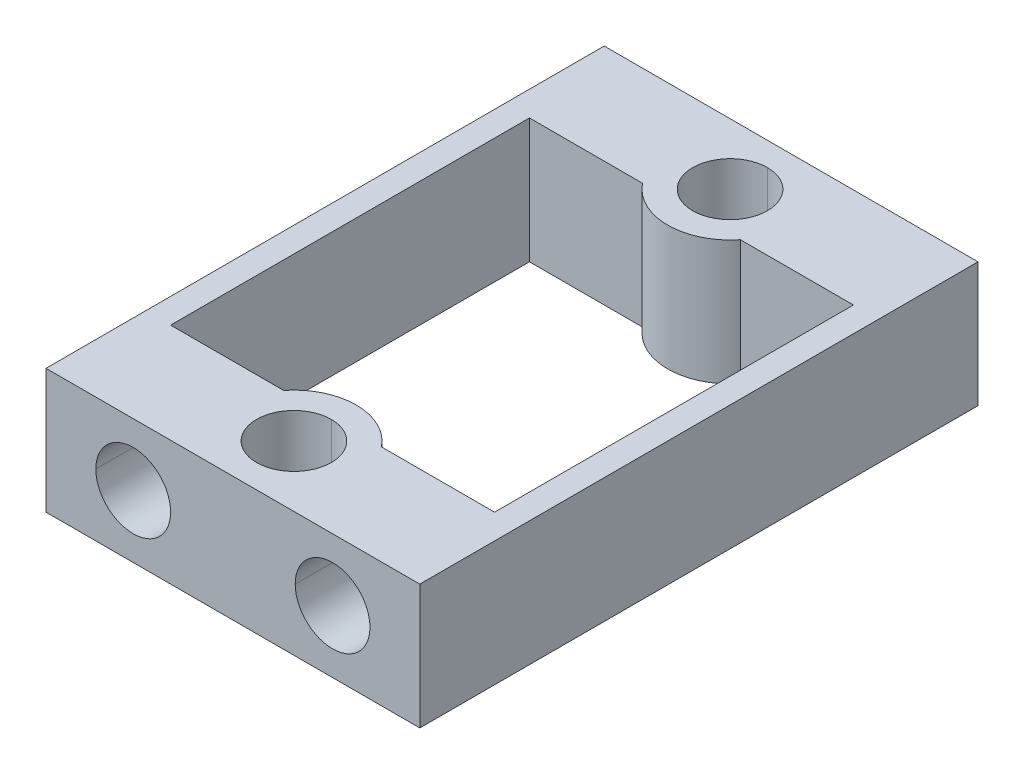
ISO-10303-21;
HEADER;
FILE_DESCRIPTION(('STEP AP214'),'2;1');
FILE_NAME('part.step','',(''),(''),'','','');
FILE_SCHEMA(('AUTOMOTIVE_DESIGN { 1 0 10303 214 1 1 1 1 }'));
ENDSEC;
DATA;
#1=APPLICATION_CONTEXT('core data for automotive mechanical design processes');
#2=APPLICATION_PROTOCOL_DEFINITION('international standard','automotive_design',2000,#1);
#3=PRODUCT_CONTEXT('',#1,'mechanical');
#4=PRODUCT('Part','Part','',(#3));
#5=PRODUCT_RELATED_PRODUCT_CATEGORY('part','',(#4));
#6=PRODUCT_DEFINITION_FORMATION('','',#4);
#7=PRODUCT_DEFINITION_CONTEXT('part definition',#1,'design');
#8=PRODUCT_DEFINITION('design','',#6,#7);
#9=PRODUCT_DEFINITION_SHAPE('','',#8);
#10=(LENGTH_UNIT() NAMED_UNIT(*) SI_UNIT(.MILLI.,.METRE.));
#11=(NAMED_UNIT(*) PLANE_ANGLE_UNIT() SI_UNIT($,.RADIAN.));
#12=(NAMED_UNIT(*) SI_UNIT($,.STERADIAN.) SOLID_ANGLE_UNIT());
#13=UNCERTAINTY_MEASURE_WITH_UNIT(LENGTH_MEASURE(1.E-05),#10,'distance_accuracy_value','');
#14=(GEOMETRIC_REPRESENTATION_CONTEXT(3) GLOBAL_UNCERTAINTY_ASSIGNED_CONTEXT((#13)) GLOBAL_UNIT_ASSIGNED_CONTEXT((#10,
#11,#12)) REPRESENTATION_CONTEXT('',''));
#15=CARTESIAN_POINT('',(0.,0.,0.));
#16=DIRECTION('',(0.,0.,1.));
#17=DIRECTION('',(1.,0.,0.));
#18=AXIS2_PLACEMENT_3D('',#15,#16,#17);
#19=CARTESIAN_POINT('',(11.5,2.5,-5.));
#20=DIRECTION('',(0.,0.,1.));
#21=DIRECTION('',(1.,0.,0.));
#22=AXIS2_PLACEMENT_3D('',#19,#20,#21);
#23=CYLINDRICAL_SURFACE('',#22,1.5);
#24=DIRECTION('',(0.,0.,1.));
#25=VECTOR('',#24,1.);
#26=CARTESIAN_POINT('',(10.,2.5,-5.));
#27=LINE('',#26,#25);
#28=CARTESIAN_POINT('',(10.,2.5,-4.));
#29=VERTEX_POINT('',#28);
#30=CARTESIAN_POINT('',(10.,2.5,0.));
#31=VERTEX_POINT('',#30);
#32=EDGE_CURVE('E195',#29,#31,#27,.T.);
#33=ORIENTED_EDGE('',*,*,#32,.F.);
#34=CARTESIAN_POINT('',(11.5,2.5,-4.));
#35=DIRECTION('',(0.,0.,-1.));
#36=DIRECTION('',(-1.,0.,0.));
#37=AXIS2_PLACEMENT_3D('',#34,#35,#36);
#38=CIRCLE('',#37,1.5);
#39=CARTESIAN_POINT('',(13.,2.5,-4.));
#40=VERTEX_POINT('',#39);
#41=EDGE_CURVE('E303',#29,#40,#38,.T.);
#42=ORIENTED_EDGE('',*,*,#41,.T.);
#43=DIRECTION('',(0.,0.,1.));
#44=VECTOR('',#43,1.);
#45=CARTESIAN_POINT('',(13.,2.5,-5.));
#46=LINE('',#45,#44);
#47=CARTESIAN_POINT('',(13.,2.5,0.));
#48=VERTEX_POINT('',#47);
#49=EDGE_CURVE('E194',#40,#48,#46,.T.);
#50=ORIENTED_EDGE('',*,*,#49,.T.);
#51=CARTESIAN_POINT('',(11.5,2.5,0.));
#52=DIRECTION('',(0.,0.,1.));
#53=DIRECTION('',(1.,0.,0.));
#54=AXIS2_PLACEMENT_3D('',#51,#52,#53);
#55=CIRCLE('',#54,1.5);
#56=EDGE_CURVE('E317',#48,#31,#55,.T.);
#57=ORIENTED_EDGE('',*,*,#56,.T.);
#58=EDGE_LOOP('',(#33,#42,#50,#57));
#59=FACE_BOUND('',#58,.T.);
#60=ADVANCED_FACE('F15',(#59),#23,.F.);
#61=CARTESIAN_POINT('',(3.5,2.5,-5.));
#62=DIRECTION('',(0.,0.,1.));
#63=DIRECTION('',(1.,0.,0.));
#64=AXIS2_PLACEMENT_3D('',#61,#62,#63);
#65=CYLINDRICAL_SURFACE('',#64,1.5);
#66=DIRECTION('',(0.,0.,1.));
#67=VECTOR('',#66,1.);
#68=CARTESIAN_POINT('',(2.,2.5,-5.));
#69=LINE('',#68,#67);
#70=CARTESIAN_POINT('',(2.,2.5,-4.));
#71=VERTEX_POINT('',#70);
#72=CARTESIAN_POINT('',(2.,2.5,0.));
#73=VERTEX_POINT('',#72);
#74=EDGE_CURVE('E260',#71,#73,#69,.T.);
#75=ORIENTED_EDGE('',*,*,#74,.F.);
#76=CARTESIAN_POINT('',(3.5,2.5,-4.));
#77=DIRECTION('',(0.,0.,-1.));
#78=DIRECTION('',(-1.,0.,0.));
#79=AXIS2_PLACEMENT_3D('',#76,#77,#78);
#80=CIRCLE('',#79,1.5);
#81=CARTESIAN_POINT('',(5.,2.5,-4.));
#82=VERTEX_POINT('',#81);
#83=EDGE_CURVE('E189',#71,#82,#80,.T.);
#84=ORIENTED_EDGE('',*,*,#83,.T.);
#85=DIRECTION('',(0.,0.,1.));
#86=VECTOR('',#85,1.);
#87=CARTESIAN_POINT('',(5.,2.5,-5.));
#88=LINE('',#87,#86);
#89=CARTESIAN_POINT('',(5.,2.5,0.));
#90=VERTEX_POINT('',#89);
#91=EDGE_CURVE('E259',#82,#90,#88,.T.);
#92=ORIENTED_EDGE('',*,*,#91,.T.);
#93=CARTESIAN_POINT('',(3.5,2.5,0.));
#94=DIRECTION('',(0.,0.,1.));
#95=DIRECTION('',(1.,0.,0.));
#96=AXIS2_PLACEMENT_3D('',#93,#94,#95);
#97=CIRCLE('',#96,1.5);
#98=EDGE_CURVE('E337',#90,#73,#97,.T.);
#99=ORIENTED_EDGE('',*,*,#98,.T.);
#100=EDGE_LOOP('',(#75,#84,#92,#99));
#101=FACE_BOUND('',#100,.T.);
#102=ADVANCED_FACE('F453',(#101),#65,.F.);
#103=CARTESIAN_POINT('',(0.,0.,0.));
#104=DIRECTION('',(0.,1.,0.));
#105=DIRECTION('',(1.,0.,0.));
#106=AXIS2_PLACEMENT_3D('',#103,#104,#105);
#107=PLANE('',#106);
#108=CARTESIAN_POINT('',(7.5,0.,-2.45));
#109=DIRECTION('',(0.,1.,0.));
#110=DIRECTION('',(0.,0.,1.));
#111=AXIS2_PLACEMENT_3D('',#108,#109,#110);
#112=CIRCLE('',#111,1.5);
#113=CARTESIAN_POINT('',(7.5,0.,-3.95));
#114=VERTEX_POINT('',#113);
#115=CARTESIAN_POINT('',(7.5,0.,-0.95));
#116=VERTEX_POINT('',#115);
#117=EDGE_CURVE('E333',#114,#116,#112,.T.);
#118=ORIENTED_EDGE('',*,*,#117,.T.);
#119=CARTESIAN_POINT('',(7.5,0.,-2.45));
#120=DIRECTION('',(0.,1.,0.));
#121=DIRECTION('',(0.,0.,1.));
#122=AXIS2_PLACEMENT_3D('',#119,#120,#121);
#123=CIRCLE('',#122,1.5);
#124=EDGE_CURVE('E9',#116,#114,#123,.T.);
#125=ORIENTED_EDGE('',*,*,#124,.T.);
#126=EDGE_LOOP('',(#118,#125));
#127=FACE_BOUND('',#126,.T.);
#128=CARTESIAN_POINT('',(7.5,0.,-19.95));
#129=DIRECTION('',(0.,1.,0.));
#130=DIRECTION('',(0.,0.,1.));
#131=AXIS2_PLACEMENT_3D('',#128,#129,#130);
#132=CIRCLE('',#131,1.5);
#133=CARTESIAN_POINT('',(7.5,0.,-21.45));
#134=VERTEX_POINT('',#133);
#135=CARTESIAN_POINT('',(7.5,0.,-18.45));
#136=VERTEX_POINT('',#135);
#137=EDGE_CURVE('E273',#134,#136,#132,.T.);
#138=ORIENTED_EDGE('',*,*,#137,.T.);
#139=CARTESIAN_POINT('',(7.5,0.,-19.95));
#140=DIRECTION('',(0.,1.,0.));
#141=DIRECTION('',(0.,0.,1.));
#142=AXIS2_PLACEMENT_3D('',#139,#140,#141);
#143=CIRCLE('',#142,1.5);
#144=EDGE_CURVE('E324',#136,#134,#143,.T.);
#145=ORIENTED_EDGE('',*,*,#144,.T.);
#146=EDGE_LOOP('',(#138,#145));
#147=FACE_BOUND('',#146,.T.);
#148=DIRECTION('',(1.,0.,0.));
#149=VECTOR('',#148,1.);
#150=CARTESIAN_POINT('',(0.,0.,-4.));
#151=LINE('',#150,#149);
#152=CARTESIAN_POINT('',(9.4615045245933,0.,-4.));
#153=VERTEX_POINT('',#152);
#154=CARTESIAN_POINT('',(14.,0.,-4.));
#155=VERTEX_POINT('',#154);
#156=EDGE_CURVE('E167',#153,#155,#151,.T.);
#157=ORIENTED_EDGE('',*,*,#156,.T.);
#158=DIRECTION('',(0.,0.,-1.));
#159=VECTOR('',#158,1.);
#160=CARTESIAN_POINT('',(14.,0.,0.));
#161=LINE('',#160,#159);
#162=CARTESIAN_POINT('',(14.,0.,-18.4));
#163=VERTEX_POINT('',#162);
#164=EDGE_CURVE('E343',#155,#163,#161,.T.);
#165=ORIENTED_EDGE('',*,*,#164,.T.);
#166=DIRECTION('',(1.,0.,0.));
#167=VECTOR('',#166,1.);
#168=CARTESIAN_POINT('',(0.,0.,-18.4));
#169=LINE('',#168,#167);
#170=CARTESIAN_POINT('',(9.4615045245933,0.,-18.4));
#171=VERTEX_POINT('',#170);
#172=EDGE_CURVE('E240',#171,#163,#169,.T.);
#173=ORIENTED_EDGE('',*,*,#172,.F.);
#174=CARTESIAN_POINT('',(7.5,0.,-19.95));
#175=DIRECTION('',(0.,1.,0.));
#176=DIRECTION('',(0.,0.,1.));
#177=AXIS2_PLACEMENT_3D('',#174,#175,#176);
#178=CIRCLE('',#177,2.5);
#179=CARTESIAN_POINT('',(5.5384954754067,0.,-18.4));
#180=VERTEX_POINT('',#179);
#181=EDGE_CURVE('E245',#180,#171,#178,.T.);
#182=ORIENTED_EDGE('',*,*,#181,.F.);
#183=DIRECTION('',(1.,0.,0.));
#184=VECTOR('',#183,1.);
#185=CARTESIAN_POINT('',(0.,0.,-18.4));
#186=LINE('',#185,#184);
#187=CARTESIAN_POINT('',(1.,0.,-18.4));
#188=VERTEX_POINT('',#187);
#189=EDGE_CURVE('E199',#188,#180,#186,.T.);
#190=ORIENTED_EDGE('',*,*,#189,.F.);
#191=DIRECTION('',(0.,0.,-1.));
#192=VECTOR('',#191,1.);
#193=CARTESIAN_POINT('',(1.,0.,0.));
#194=LINE('',#193,#192);
#195=CARTESIAN_POINT('',(1.,0.,-4.));
#196=VERTEX_POINT('',#195);
#197=EDGE_CURVE('E184',#196,#188,#194,.T.);
#198=ORIENTED_EDGE('',*,*,#197,.F.);
#199=DIRECTION('',(1.,0.,0.));
#200=VECTOR('',#199,1.);
#201=CARTESIAN_POINT('',(0.,0.,-4.));
#202=LINE('',#201,#200);
#203=CARTESIAN_POINT('',(5.5384954754067,0.,-4.));
#204=VERTEX_POINT('',#203);
#205=EDGE_CURVE('E383',#196,#204,#202,.T.);
#206=ORIENTED_EDGE('',*,*,#205,.T.);
#207=CARTESIAN_POINT('',(7.5,0.,-2.45));
#208=DIRECTION('',(0.,1.,0.));
#209=DIRECTION('',(0.,0.,1.));
#210=AXIS2_PLACEMENT_3D('',#207,#208,#209);
#211=CIRCLE('',#210,2.5);
#212=CARTESIAN_POINT('',(7.5,0.,-4.95));
#213=VERTEX_POINT('',#212);
#214=EDGE_CURVE('E288',#213,#204,#211,.T.);
#215=ORIENTED_EDGE('',*,*,#214,.F.);
#216=CARTESIAN_POINT('',(7.5,0.,-2.45));
#217=DIRECTION('',(0.,1.,0.));
#218=DIRECTION('',(0.,0.,1.));
#219=AXIS2_PLACEMENT_3D('',#216,#217,#218);
#220=CIRCLE('',#219,2.5);
#221=EDGE_CURVE('E302',#153,#213,#220,.T.);
#222=ORIENTED_EDGE('',*,*,#221,.F.);
#223=EDGE_LOOP('',(#157,#165,#173,#182,#190,#198,#206,#215,#222));
#224=FACE_BOUND('',#223,.T.);
#225=DIRECTION('',(1.,0.,0.));
#226=VECTOR('',#225,1.);
#227=CARTESIAN_POINT('',(0.,0.,0.));
#228=LINE('',#227,#226);
#229=CARTESIAN_POINT('',(0.,0.,0.));
#230=VERTEX_POINT('',#229);
#231=CARTESIAN_POINT('',(15.,0.,0.));
#232=VERTEX_POINT('',#231);
#233=EDGE_CURVE('E261',#230,#232,#228,.T.);
#234=ORIENTED_EDGE('',*,*,#233,.F.);
#235=DIRECTION('',(0.,0.,-1.));
#236=VECTOR('',#235,1.);
#237=CARTESIAN_POINT('',(0.,0.,0.));
#238=LINE('',#237,#236);
#239=CARTESIAN_POINT('',(0.,0.,-22.4));
#240=VERTEX_POINT('',#239);
#241=EDGE_CURVE('E156',#230,#240,#238,.T.);
#242=ORIENTED_EDGE('',*,*,#241,.T.);
#243=DIRECTION('',(1.,0.,0.));
#244=VECTOR('',#243,1.);
#245=CARTESIAN_POINT('',(0.,0.,-22.4));
#246=LINE('',#245,#244);
#247=CARTESIAN_POINT('',(15.,0.,-22.4));
#248=VERTEX_POINT('',#247);
#249=EDGE_CURVE('E170',#240,#248,#246,.T.);
#250=ORIENTED_EDGE('',*,*,#249,.T.);
#251=DIRECTION('',(0.,0.,-1.));
#252=VECTOR('',#251,1.);
#253=CARTESIAN_POINT('',(15.,0.,0.));
#254=LINE('',#253,#252);
#255=EDGE_CURVE('E313',#232,#248,#254,.T.);
#256=ORIENTED_EDGE('',*,*,#255,.F.);
#257=EDGE_LOOP('',(#234,#242,#250,#256));
#258=FACE_BOUND('',#257,.T.);
#259=ADVANCED_FACE('F400',(#127,#147,#224,#258),#107,.F.);
#260=CARTESIAN_POINT('',(0.,5.,0.));
#261=DIRECTION('',(0.,1.,0.));
#262=DIRECTION('',(1.,0.,0.));
#263=AXIS2_PLACEMENT_3D('',#260,#261,#262);
#264=PLANE('',#263);
#265=CARTESIAN_POINT('',(7.5,5.,-2.45));
#266=DIRECTION('',(0.,1.,0.));
#267=DIRECTION('',(0.,0.,1.));
#268=AXIS2_PLACEMENT_3D('',#265,#266,#267);
#269=CIRCLE('',#268,1.5);
#270=CARTESIAN_POINT('',(7.5,5.,-3.95));
#271=VERTEX_POINT('',#270);
#272=CARTESIAN_POINT('',(7.5,5.,-0.95));
#273=VERTEX_POINT('',#272);
#274=EDGE_CURVE('E290',#271,#273,#269,.T.);
#275=ORIENTED_EDGE('',*,*,#274,.F.);
#276=CARTESIAN_POINT('',(7.5,5.,-2.45));
#277=DIRECTION('',(0.,1.,0.));
#278=DIRECTION('',(0.,0.,1.));
#279=AXIS2_PLACEMENT_3D('',#276,#277,#278);
#280=CIRCLE('',#279,1.5);
#281=EDGE_CURVE('E26',#273,#271,#280,.T.);
#282=ORIENTED_EDGE('',*,*,#281,.F.);
#283=EDGE_LOOP('',(#275,#282));
#284=FACE_BOUND('',#283,.T.);
#285=CARTESIAN_POINT('',(7.5,5.,-19.95));
#286=DIRECTION('',(0.,1.,0.));
#287=DIRECTION('',(0.,0.,1.));
#288=AXIS2_PLACEMENT_3D('',#285,#286,#287);
#289=CIRCLE('',#288,1.5);
#290=CARTESIAN_POINT('',(7.5,5.,-21.45));
#291=VERTEX_POINT('',#290);
#292=CARTESIAN_POINT('',(7.5,5.,-18.45));
#293=VERTEX_POINT('',#292);
#294=EDGE_CURVE('E249',#291,#293,#289,.T.);
#295=ORIENTED_EDGE('',*,*,#294,.F.);
#296=CARTESIAN_POINT('',(7.5,5.,-19.95));
#297=DIRECTION('',(0.,1.,0.));
#298=DIRECTION('',(0.,0.,1.));
#299=AXIS2_PLACEMENT_3D('',#296,#297,#298);
#300=CIRCLE('',#299,1.5);
#301=EDGE_CURVE('E155',#293,#291,#300,.T.);
#302=ORIENTED_EDGE('',*,*,#301,.F.);
#303=EDGE_LOOP('',(#295,#302));
#304=FACE_BOUND('',#303,.T.);
#305=DIRECTION('',(1.,0.,0.));
#306=VECTOR('',#305,1.);
#307=CARTESIAN_POINT('',(0.,5.,-4.));
#308=LINE('',#307,#306);
#309=CARTESIAN_POINT('',(9.4615045245933,5.,-4.));
#310=VERTEX_POINT('',#309);
#311=CARTESIAN_POINT('',(14.,5.,-4.));
#312=VERTEX_POINT('',#311);
#313=EDGE_CURVE('E229',#310,#312,#308,.T.);
#314=ORIENTED_EDGE('',*,*,#313,.F.);
#315=CARTESIAN_POINT('',(7.5,5.,-2.45));
#316=DIRECTION('',(0.,1.,0.));
#317=DIRECTION('',(0.,0.,1.));
#318=AXIS2_PLACEMENT_3D('',#315,#316,#317);
#319=CIRCLE('',#318,2.5);
#320=CARTESIAN_POINT('',(7.5,5.,-4.95));
#321=VERTEX_POINT('',#320);
#322=EDGE_CURVE('E299',#310,#321,#319,.T.);
#323=ORIENTED_EDGE('',*,*,#322,.T.);
#324=CARTESIAN_POINT('',(7.5,5.,-2.45));
#325=DIRECTION('',(0.,1.,0.));
#326=DIRECTION('',(0.,0.,1.));
#327=AXIS2_PLACEMENT_3D('',#324,#325,#326);
#328=CIRCLE('',#327,2.5);
#329=CARTESIAN_POINT('',(5.5384954754067,5.,-4.));
#330=VERTEX_POINT('',#329);
#331=EDGE_CURVE('E289',#321,#330,#328,.T.);
#332=ORIENTED_EDGE('',*,*,#331,.T.);
#333=DIRECTION('',(1.,0.,0.));
#334=VECTOR('',#333,1.);
#335=CARTESIAN_POINT('',(0.,5.,-4.));
#336=LINE('',#335,#334);
#337=CARTESIAN_POINT('',(1.,5.,-4.));
#338=VERTEX_POINT('',#337);
#339=EDGE_CURVE('E312',#338,#330,#336,.T.);
#340=ORIENTED_EDGE('',*,*,#339,.F.);
#341=DIRECTION('',(0.,0.,-1.));
#342=VECTOR('',#341,1.);
#343=CARTESIAN_POINT('',(1.,5.,0.));
#344=LINE('',#343,#342);
#345=CARTESIAN_POINT('',(1.,5.,-18.4));
#346=VERTEX_POINT('',#345);
#347=EDGE_CURVE('E203',#338,#346,#344,.T.);
#348=ORIENTED_EDGE('',*,*,#347,.T.);
#349=DIRECTION('',(1.,0.,0.));
#350=VECTOR('',#349,1.);
#351=CARTESIAN_POINT('',(0.,5.,-18.4));
#352=LINE('',#351,#350);
#353=CARTESIAN_POINT('',(5.5384954754067,5.,-18.4));
#354=VERTEX_POINT('',#353);
#355=EDGE_CURVE('E213',#346,#354,#352,.T.);
#356=ORIENTED_EDGE('',*,*,#355,.T.);
#357=CARTESIAN_POINT('',(7.5,5.,-19.95));
#358=DIRECTION('',(0.,1.,0.));
#359=DIRECTION('',(0.,0.,1.));
#360=AXIS2_PLACEMENT_3D('',#357,#358,#359);
#361=CIRCLE('',#360,2.5);
#362=CARTESIAN_POINT('',(9.4615045245933,5.,-18.4));
#363=VERTEX_POINT('',#362);
#364=EDGE_CURVE('E236',#354,#363,#361,.T.);
#365=ORIENTED_EDGE('',*,*,#364,.T.);
#366=DIRECTION('',(1.,0.,0.));
#367=VECTOR('',#366,1.);
#368=CARTESIAN_POINT('',(0.,5.,-18.4));
#369=LINE('',#368,#367);
#370=CARTESIAN_POINT('',(14.,5.,-18.4));
#371=VERTEX_POINT('',#370);
#372=EDGE_CURVE('E183',#363,#371,#369,.T.);
#373=ORIENTED_EDGE('',*,*,#372,.T.);
#374=DIRECTION('',(0.,0.,-1.));
#375=VECTOR('',#374,1.);
#376=CARTESIAN_POINT('',(14.,5.,0.));
#377=LINE('',#376,#375);
#378=EDGE_CURVE('E41',#312,#371,#377,.T.);
#379=ORIENTED_EDGE('',*,*,#378,.F.);
#380=EDGE_LOOP('',(#314,#323,#332,#340,#348,#356,#365,#373,#379));
#381=FACE_BOUND('',#380,.T.);
#382=DIRECTION('',(1.,0.,0.));
#383=VECTOR('',#382,1.);
#384=CARTESIAN_POINT('',(0.,5.,0.));
#385=LINE('',#384,#383);
#386=CARTESIAN_POINT('',(0.,5.,0.));
#387=VERTEX_POINT('',#386);
#388=CARTESIAN_POINT('',(15.,5.,0.));
#389=VERTEX_POINT('',#388);
#390=EDGE_CURVE('E267',#387,#389,#385,.T.);
#391=ORIENTED_EDGE('',*,*,#390,.T.);
#392=DIRECTION('',(0.,0.,-1.));
#393=VECTOR('',#392,1.);
#394=CARTESIAN_POINT('',(15.,5.,0.));
#395=LINE('',#394,#393);
#396=CARTESIAN_POINT('',(15.,5.,-22.4));
#397=VERTEX_POINT('',#396);
#398=EDGE_CURVE('E162',#389,#397,#395,.T.);
#399=ORIENTED_EDGE('',*,*,#398,.T.);
#400=DIRECTION('',(1.,0.,0.));
#401=VECTOR('',#400,1.);
#402=CARTESIAN_POINT('',(0.,5.,-22.4));
#403=LINE('',#402,#401);
#404=CARTESIAN_POINT('',(0.,5.,-22.4));
#405=VERTEX_POINT('',#404);
#406=EDGE_CURVE('E159',#405,#397,#403,.T.);
#407=ORIENTED_EDGE('',*,*,#406,.F.);
#408=DIRECTION('',(0.,0.,-1.));
#409=VECTOR('',#408,1.);
#410=CARTESIAN_POINT('',(0.,5.,0.));
#411=LINE('',#410,#409);
#412=EDGE_CURVE('E143',#387,#405,#411,.T.);
#413=ORIENTED_EDGE('',*,*,#412,.F.);
#414=EDGE_LOOP('',(#391,#399,#407,#413));
#415=FACE_BOUND('',#414,.T.);
#416=ADVANCED_FACE('F160',(#284,#304,#381,#415),#264,.T.);
#417=CARTESIAN_POINT('',(7.5,5.,-2.45));
#418=DIRECTION('',(0.,-1.,0.));
#419=DIRECTION('',(0.,0.,-1.));
#420=AXIS2_PLACEMENT_3D('',#417,#418,#419);
#421=CYLINDRICAL_SURFACE('',#420,1.5);
#422=DIRECTION('',(0.,-1.,0.));
#423=VECTOR('',#422,1.);
#424=CARTESIAN_POINT('',(7.5,5.,-0.95));
#425=LINE('',#424,#423);
#426=EDGE_CURVE('E294',#273,#116,#425,.T.);
#427=ORIENTED_EDGE('',*,*,#426,.F.);
#428=ORIENTED_EDGE('',*,*,#281,.T.);
#429=DIRECTION('',(0.,-1.,0.));
#430=VECTOR('',#429,1.);
#431=CARTESIAN_POINT('',(7.5,5.,-3.95));
#432=LINE('',#431,#430);
#433=EDGE_CURVE('E254',#271,#114,#432,.T.);
#434=ORIENTED_EDGE('',*,*,#433,.T.);
#435=ORIENTED_EDGE('',*,*,#124,.F.);
#436=EDGE_LOOP('',(#427,#428,#434,#435));
#437=FACE_BOUND('',#436,.T.);
#438=ADVANCED_FACE('F440',(#437),#421,.F.);
#439=CARTESIAN_POINT('',(14.,5.,0.));
#440=DIRECTION('',(-1.,0.,0.));
#441=DIRECTION('',(0.,0.,1.));
#442=AXIS2_PLACEMENT_3D('',#439,#440,#441);
#443=PLANE('',#442);
#444=ORIENTED_EDGE('',*,*,#164,.F.);
#445=DIRECTION('',(0.,-1.,0.));
#446=VECTOR('',#445,1.);
#447=CARTESIAN_POINT('',(14.,5.,-4.));
#448=LINE('',#447,#446);
#449=EDGE_CURVE('E19',#312,#155,#448,.T.);
#450=ORIENTED_EDGE('',*,*,#449,.F.);
#451=ORIENTED_EDGE('',*,*,#378,.T.);
#452=DIRECTION('',(0.,-1.,0.));
#453=VECTOR('',#452,1.);
#454=CARTESIAN_POINT('',(14.,5.,-18.4));
#455=LINE('',#454,#453);
#456=EDGE_CURVE('E242',#371,#163,#455,.T.);
#457=ORIENTED_EDGE('',*,*,#456,.T.);
#458=EDGE_LOOP('',(#444,#450,#451,#457));
#459=FACE_BOUND('',#458,.T.);
#460=ADVANCED_FACE('F434',(#459),#443,.T.);
#461=CARTESIAN_POINT('',(7.5,5.,-19.95));
#462=DIRECTION('',(0.,-1.,0.));
#463=DIRECTION('',(0.,0.,-1.));
#464=AXIS2_PLACEMENT_3D('',#461,#462,#463);
#465=CYLINDRICAL_SURFACE('',#464,1.5);
#466=DIRECTION('',(0.,-1.,0.));
#467=VECTOR('',#466,1.);
#468=CARTESIAN_POINT('',(7.5,5.,-18.45));
#469=LINE('',#468,#467);
#470=EDGE_CURVE('E253',#293,#136,#469,.T.);
#471=ORIENTED_EDGE('',*,*,#470,.F.);
#472=ORIENTED_EDGE('',*,*,#301,.T.);
#473=DIRECTION('',(0.,-1.,0.));
#474=VECTOR('',#473,1.);
#475=CARTESIAN_POINT('',(7.5,5.,-21.45));
#476=LINE('',#475,#474);
#477=EDGE_CURVE('E277',#291,#134,#476,.T.);
#478=ORIENTED_EDGE('',*,*,#477,.T.);
#479=ORIENTED_EDGE('',*,*,#144,.F.);
#480=EDGE_LOOP('',(#471,#472,#478,#479));
#481=FACE_BOUND('',#480,.T.);
#482=ADVANCED_FACE('F439',(#481),#465,.F.);
#483=CARTESIAN_POINT('',(0.,5.,0.));
#484=DIRECTION('',(-1.,0.,0.));
#485=DIRECTION('',(0.,1.,0.));
#486=AXIS2_PLACEMENT_3D('',#483,#484,#485);
#487=PLANE('',#486);
#488=ORIENTED_EDGE('',*,*,#241,.F.);
#489=DIRECTION('',(0.,-1.,0.));
#490=VECTOR('',#489,1.);
#491=CARTESIAN_POINT('',(0.,5.,0.));
#492=LINE('',#491,#490);
#493=EDGE_CURVE('E150',#387,#230,#492,.T.);
#494=ORIENTED_EDGE('',*,*,#493,.F.);
#495=ORIENTED_EDGE('',*,*,#412,.T.);
#496=DIRECTION('',(0.,-1.,0.));
#497=VECTOR('',#496,1.);
#498=CARTESIAN_POINT('',(0.,5.,-22.4));
#499=LINE('',#498,#497);
#500=EDGE_CURVE('E147',#405,#240,#499,.T.);
#501=ORIENTED_EDGE('',*,*,#500,.T.);
#502=EDGE_LOOP('',(#488,#494,#495,#501));
#503=FACE_BOUND('',#502,.T.);
#504=ADVANCED_FACE('F145',(#503),#487,.T.);
#505=CARTESIAN_POINT('',(0.,5.,-18.4));
#506=DIRECTION('',(0.,0.,-1.));
#507=DIRECTION('',(0.,-1.,0.));
#508=AXIS2_PLACEMENT_3D('',#505,#506,#507);
#509=PLANE('',#508);
#510=ORIENTED_EDGE('',*,*,#172,.T.);
#511=ORIENTED_EDGE('',*,*,#456,.F.);
#512=ORIENTED_EDGE('',*,*,#372,.F.);
#513=DIRECTION('',(0.,-1.,0.));
#514=VECTOR('',#513,1.);
#515=CARTESIAN_POINT('',(9.4615045245933,5.,-18.4));
#516=LINE('',#515,#514);
#517=EDGE_CURVE('E241',#363,#171,#516,.T.);
#518=ORIENTED_EDGE('',*,*,#517,.T.);
#519=EDGE_LOOP('',(#510,#511,#512,#518));
#520=FACE_BOUND('',#519,.T.);
#521=ADVANCED_FACE('F561',(#520),#509,.F.);
#522=CARTESIAN_POINT('',(7.5,5.,-19.95));
#523=DIRECTION('',(0.,-1.,0.));
#524=DIRECTION('',(0.,0.,-1.));
#525=AXIS2_PLACEMENT_3D('',#522,#523,#524);
#526=CYLINDRICAL_SURFACE('',#525,2.5);
#527=ORIENTED_EDGE('',*,*,#181,.T.);
#528=ORIENTED_EDGE('',*,*,#517,.F.);
#529=ORIENTED_EDGE('',*,*,#364,.F.);
#530=DIRECTION('',(0.,-1.,0.));
#531=VECTOR('',#530,1.);
#532=CARTESIAN_POINT('',(5.5384954754067,5.,-18.4));
#533=LINE('',#532,#531);
#534=EDGE_CURVE('E202',#354,#180,#533,.T.);
#535=ORIENTED_EDGE('',*,*,#534,.T.);
#536=EDGE_LOOP('',(#527,#528,#529,#535));
#537=FACE_BOUND('',#536,.T.);
#538=ADVANCED_FACE('F424',(#537),#526,.T.);
#539=CARTESIAN_POINT('',(0.,5.,-18.4));
#540=DIRECTION('',(0.,0.,-1.));
#541=DIRECTION('',(0.,-1.,0.));
#542=AXIS2_PLACEMENT_3D('',#539,#540,#541);
#543=PLANE('',#542);
#544=ORIENTED_EDGE('',*,*,#189,.T.);
#545=ORIENTED_EDGE('',*,*,#534,.F.);
#546=ORIENTED_EDGE('',*,*,#355,.F.);
#547=DIRECTION('',(0.,-1.,0.));
#548=VECTOR('',#547,1.);
#549=CARTESIAN_POINT('',(1.,5.,-18.4));
#550=LINE('',#549,#548);
#551=EDGE_CURVE('E188',#346,#188,#550,.T.);
#552=ORIENTED_EDGE('',*,*,#551,.T.);
#553=EDGE_LOOP('',(#544,#545,#546,#552));
#554=FACE_BOUND('',#553,.T.);
#555=ADVANCED_FACE('F418',(#554),#543,.F.);
#556=CARTESIAN_POINT('',(1.,5.,0.));
#557=DIRECTION('',(-1.,0.,0.));
#558=DIRECTION('',(0.,0.,1.));
#559=AXIS2_PLACEMENT_3D('',#556,#557,#558);
#560=PLANE('',#559);
#561=ORIENTED_EDGE('',*,*,#197,.T.);
#562=ORIENTED_EDGE('',*,*,#551,.F.);
#563=ORIENTED_EDGE('',*,*,#347,.F.);
#564=DIRECTION('',(0.,-1.,0.));
#565=VECTOR('',#564,1.);
#566=CARTESIAN_POINT('',(1.,5.,-4.));
#567=LINE('',#566,#565);
#568=EDGE_CURVE('E326',#338,#196,#567,.T.);
#569=ORIENTED_EDGE('',*,*,#568,.T.);
#570=EDGE_LOOP('',(#561,#562,#563,#569));
#571=FACE_BOUND('',#570,.T.);
#572=ADVANCED_FACE('F423',(#571),#560,.F.);
#573=CARTESIAN_POINT('',(0.,5.,-4.));
#574=DIRECTION('',(0.,0.,-1.));
#575=DIRECTION('',(0.,-1.,0.));
#576=AXIS2_PLACEMENT_3D('',#573,#574,#575);
#577=PLANE('',#576);
#578=CARTESIAN_POINT('',(3.5,2.5,-4.));
#579=DIRECTION('',(0.,0.,-1.));
#580=DIRECTION('',(-1.,0.,0.));
#581=AXIS2_PLACEMENT_3D('',#578,#579,#580);
#582=CIRCLE('',#581,1.5);
#583=EDGE_CURVE('E295',#82,#71,#582,.T.);
#584=ORIENTED_EDGE('',*,*,#583,.F.);
#585=ORIENTED_EDGE('',*,*,#83,.F.);
#586=EDGE_LOOP('',(#584,#585));
#587=FACE_BOUND('',#586,.T.);
#588=ORIENTED_EDGE('',*,*,#205,.F.);
#589=ORIENTED_EDGE('',*,*,#568,.F.);
#590=ORIENTED_EDGE('',*,*,#339,.T.);
#591=DIRECTION('',(0.,-1.,0.));
#592=VECTOR('',#591,1.);
#593=CARTESIAN_POINT('',(5.5384954754067,5.,-4.));
#594=LINE('',#593,#592);
#595=EDGE_CURVE('E266',#330,#204,#594,.T.);
#596=ORIENTED_EDGE('',*,*,#595,.T.);
#597=EDGE_LOOP('',(#588,#589,#590,#596));
#598=FACE_BOUND('',#597,.T.);
#599=ADVANCED_FACE('F573',(#587,#598),#577,.T.);
#600=CARTESIAN_POINT('',(7.5,5.,-2.45));
#601=DIRECTION('',(0.,-1.,0.));
#602=DIRECTION('',(0.,0.,-1.));
#603=AXIS2_PLACEMENT_3D('',#600,#601,#602);
#604=CYLINDRICAL_SURFACE('',#603,2.5);
#605=DIRECTION('',(0.,-1.,0.));
#606=VECTOR('',#605,1.);
#607=CARTESIAN_POINT('',(7.5,5.,-4.95));
#608=LINE('',#607,#606);
#609=EDGE_CURVE('E284',#321,#213,#608,.T.);
#610=ORIENTED_EDGE('',*,*,#609,.F.);
#611=ORIENTED_EDGE('',*,*,#322,.F.);
#612=DIRECTION('',(0.,-1.,0.));
#613=VECTOR('',#612,1.);
#614=CARTESIAN_POINT('',(9.4615045245933,5.,-4.));
#615=LINE('',#614,#613);
#616=EDGE_CURVE('E232',#310,#153,#615,.T.);
#617=ORIENTED_EDGE('',*,*,#616,.T.);
#618=ORIENTED_EDGE('',*,*,#221,.T.);
#619=EDGE_LOOP('',(#610,#611,#617,#618));
#620=FACE_BOUND('',#619,.T.);
#621=ADVANCED_FACE('F582',(#620),#604,.T.);
#622=CARTESIAN_POINT('',(0.,5.,-4.));
#623=DIRECTION('',(0.,0.,-1.));
#624=DIRECTION('',(0.,-1.,0.));
#625=AXIS2_PLACEMENT_3D('',#622,#623,#624);
#626=PLANE('',#625);
#627=CARTESIAN_POINT('',(11.5,2.5,-4.));
#628=DIRECTION('',(0.,0.,-1.));
#629=DIRECTION('',(-1.,0.,0.));
#630=AXIS2_PLACEMENT_3D('',#627,#628,#629);
#631=CIRCLE('',#630,1.5);
#632=EDGE_CURVE('E196',#40,#29,#631,.T.);
#633=ORIENTED_EDGE('',*,*,#632,.F.);
#634=ORIENTED_EDGE('',*,*,#41,.F.);
#635=EDGE_LOOP('',(#633,#634));
#636=FACE_BOUND('',#635,.T.);
#637=ORIENTED_EDGE('',*,*,#156,.F.);
#638=ORIENTED_EDGE('',*,*,#616,.F.);
#639=ORIENTED_EDGE('',*,*,#313,.T.);
#640=ORIENTED_EDGE('',*,*,#449,.T.);
#641=EDGE_LOOP('',(#637,#638,#639,#640));
#642=FACE_BOUND('',#641,.T.);
#643=ADVANCED_FACE('F17',(#636,#642),#626,.T.);
#644=CARTESIAN_POINT('',(0.,5.,-22.4));
#645=DIRECTION('',(0.,0.,-1.));
#646=DIRECTION('',(0.,-1.,0.));
#647=AXIS2_PLACEMENT_3D('',#644,#645,#646);
#648=PLANE('',#647);
#649=ORIENTED_EDGE('',*,*,#249,.F.);
#650=ORIENTED_EDGE('',*,*,#500,.F.);
#651=ORIENTED_EDGE('',*,*,#406,.T.);
#652=DIRECTION('',(0.,-1.,0.));
#653=VECTOR('',#652,1.);
#654=CARTESIAN_POINT('',(15.,5.,-22.4));
#655=LINE('',#654,#653);
#656=EDGE_CURVE('E280',#397,#248,#655,.T.);
#657=ORIENTED_EDGE('',*,*,#656,.T.);
#658=EDGE_LOOP('',(#649,#650,#651,#657));
#659=FACE_BOUND('',#658,.T.);
#660=ADVANCED_FACE('F169',(#659),#648,.T.);
#661=CARTESIAN_POINT('',(15.,5.,0.));
#662=DIRECTION('',(-1.,0.,0.));
#663=DIRECTION('',(0.,1.,0.));
#664=AXIS2_PLACEMENT_3D('',#661,#662,#663);
#665=PLANE('',#664);
#666=ORIENTED_EDGE('',*,*,#255,.T.);
#667=ORIENTED_EDGE('',*,*,#656,.F.);
#668=ORIENTED_EDGE('',*,*,#398,.F.);
#669=DIRECTION('',(0.,-1.,0.));
#670=VECTOR('',#669,1.);
#671=CARTESIAN_POINT('',(15.,5.,0.));
#672=LINE('',#671,#670);
#673=EDGE_CURVE('E265',#389,#232,#672,.T.);
#674=ORIENTED_EDGE('',*,*,#673,.T.);
#675=EDGE_LOOP('',(#666,#667,#668,#674));
#676=FACE_BOUND('',#675,.T.);
#677=ADVANCED_FACE('F549',(#676),#665,.F.);
#678=CARTESIAN_POINT('',(0.,5.,0.));
#679=DIRECTION('',(0.,0.,-1.));
#680=DIRECTION('',(0.,-1.,0.));
#681=AXIS2_PLACEMENT_3D('',#678,#679,#680);
#682=PLANE('',#681);
#683=ORIENTED_EDGE('',*,*,#56,.F.);
#684=CARTESIAN_POINT('',(11.5,2.5,0.));
#685=DIRECTION('',(0.,0.,1.));
#686=DIRECTION('',(1.,0.,0.));
#687=AXIS2_PLACEMENT_3D('',#684,#685,#686);
#688=CIRCLE('',#687,1.5);
#689=EDGE_CURVE('E190',#31,#48,#688,.T.);
#690=ORIENTED_EDGE('',*,*,#689,.F.);
#691=EDGE_LOOP('',(#683,#690));
#692=FACE_BOUND('',#691,.T.);
#693=ORIENTED_EDGE('',*,*,#98,.F.);
#694=CARTESIAN_POINT('',(3.5,2.5,0.));
#695=DIRECTION('',(0.,0.,1.));
#696=DIRECTION('',(1.,0.,0.));
#697=AXIS2_PLACEMENT_3D('',#694,#695,#696);
#698=CIRCLE('',#697,1.5);
#699=EDGE_CURVE('E255',#73,#90,#698,.T.);
#700=ORIENTED_EDGE('',*,*,#699,.F.);
#701=EDGE_LOOP('',(#693,#700));
#702=FACE_BOUND('',#701,.T.);
#703=ORIENTED_EDGE('',*,*,#233,.T.);
#704=ORIENTED_EDGE('',*,*,#673,.F.);
#705=ORIENTED_EDGE('',*,*,#390,.F.);
#706=ORIENTED_EDGE('',*,*,#493,.T.);
#707=EDGE_LOOP('',(#703,#704,#705,#706));
#708=FACE_BOUND('',#707,.T.);
#709=ADVANCED_FACE('F536',(#692,#702,#708),#682,.F.);
#710=CARTESIAN_POINT('',(7.5,5.,-2.45));
#711=DIRECTION('',(0.,-1.,0.));
#712=DIRECTION('',(0.,0.,-1.));
#713=AXIS2_PLACEMENT_3D('',#710,#711,#712);
#714=CYLINDRICAL_SURFACE('',#713,2.5);
#715=ORIENTED_EDGE('',*,*,#331,.F.);
#716=ORIENTED_EDGE('',*,*,#609,.T.);
#717=ORIENTED_EDGE('',*,*,#214,.T.);
#718=ORIENTED_EDGE('',*,*,#595,.F.);
#719=EDGE_LOOP('',(#715,#716,#717,#718));
#720=FACE_BOUND('',#719,.T.);
#721=ADVANCED_FACE('F524',(#720),#714,.T.);
#722=CARTESIAN_POINT('',(7.5,5.,-19.95));
#723=DIRECTION('',(0.,-1.,0.));
#724=DIRECTION('',(0.,0.,-1.));
#725=AXIS2_PLACEMENT_3D('',#722,#723,#724);
#726=CYLINDRICAL_SURFACE('',#725,1.5);
#727=ORIENTED_EDGE('',*,*,#294,.T.);
#728=ORIENTED_EDGE('',*,*,#470,.T.);
#729=ORIENTED_EDGE('',*,*,#137,.F.);
#730=ORIENTED_EDGE('',*,*,#477,.F.);
#731=EDGE_LOOP('',(#727,#728,#729,#730));
#732=FACE_BOUND('',#731,.T.);
#733=ADVANCED_FACE('F512',(#732),#726,.F.);
#734=CARTESIAN_POINT('',(7.5,5.,-2.45));
#735=DIRECTION('',(0.,-1.,0.));
#736=DIRECTION('',(0.,0.,-1.));
#737=AXIS2_PLACEMENT_3D('',#734,#735,#736);
#738=CYLINDRICAL_SURFACE('',#737,1.5);
#739=ORIENTED_EDGE('',*,*,#274,.T.);
#740=ORIENTED_EDGE('',*,*,#426,.T.);
#741=ORIENTED_EDGE('',*,*,#117,.F.);
#742=ORIENTED_EDGE('',*,*,#433,.F.);
#743=EDGE_LOOP('',(#739,#740,#741,#742));
#744=FACE_BOUND('',#743,.T.);
#745=ADVANCED_FACE('F490',(#744),#738,.F.);
#746=CARTESIAN_POINT('',(3.5,2.5,-5.));
#747=DIRECTION('',(0.,0.,1.));
#748=DIRECTION('',(1.,0.,0.));
#749=AXIS2_PLACEMENT_3D('',#746,#747,#748);
#750=CYLINDRICAL_SURFACE('',#749,1.5);
#751=ORIENTED_EDGE('',*,*,#583,.T.);
#752=ORIENTED_EDGE('',*,*,#74,.T.);
#753=ORIENTED_EDGE('',*,*,#699,.T.);
#754=ORIENTED_EDGE('',*,*,#91,.F.);
#755=EDGE_LOOP('',(#751,#752,#753,#754));
#756=FACE_BOUND('',#755,.T.);
#757=ADVANCED_FACE('F468',(#756),#750,.F.);
#758=CARTESIAN_POINT('',(11.5,2.5,-5.));
#759=DIRECTION('',(0.,0.,1.));
#760=DIRECTION('',(1.,0.,0.));
#761=AXIS2_PLACEMENT_3D('',#758,#759,#760);
#762=CYLINDRICAL_SURFACE('',#761,1.5);
#763=ORIENTED_EDGE('',*,*,#632,.T.);
#764=ORIENTED_EDGE('',*,*,#32,.T.);
#765=ORIENTED_EDGE('',*,*,#689,.T.);
#766=ORIENTED_EDGE('',*,*,#49,.F.);
#767=EDGE_LOOP('',(#763,#764,#765,#766));
#768=FACE_BOUND('',#767,.T.);
#769=ADVANCED_FACE('F463',(#768),#762,.F.);
#770=CLOSED_SHELL('',(#60,#102,#259,#416,#438,#460,#482,#504,#521,#538,#555,#572,#599,#621,#643,
#660,#677,#709,#721,#733,#745,#757,#769));
#771=MANIFOLD_SOLID_BREP('B1',#770);
#772=ADVANCED_BREP_SHAPE_REPRESENTATION('',(#18,#771),#14);
#773=SHAPE_DEFINITION_REPRESENTATION(#9,#772);
ENDSEC;
END-ISO-10303-21;
